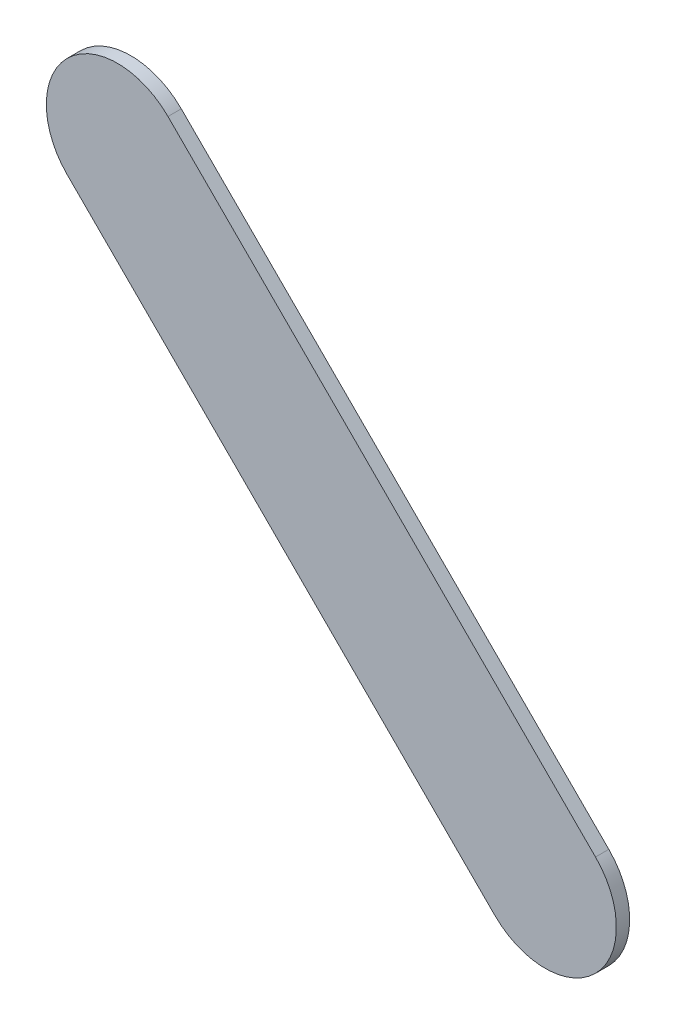
ISO-10303-21;
HEADER;
FILE_DESCRIPTION(('STEP AP214'),'2;1');
FILE_NAME('part.step','',(''),(''),'','','');
FILE_SCHEMA(('AUTOMOTIVE_DESIGN { 1 0 10303 214 1 1 1 1 }'));
ENDSEC;
DATA;
#1=APPLICATION_CONTEXT('core data for automotive mechanical design processes');
#2=APPLICATION_PROTOCOL_DEFINITION('international standard','automotive_design',2000,#1);
#3=PRODUCT_CONTEXT('',#1,'mechanical');
#4=PRODUCT('Part','Part','',(#3));
#5=PRODUCT_RELATED_PRODUCT_CATEGORY('part','',(#4));
#6=PRODUCT_DEFINITION_FORMATION('','',#4);
#7=PRODUCT_DEFINITION_CONTEXT('part definition',#1,'design');
#8=PRODUCT_DEFINITION('design','',#6,#7);
#9=PRODUCT_DEFINITION_SHAPE('','',#8);
#10=(LENGTH_UNIT() NAMED_UNIT(*) SI_UNIT(.MILLI.,.METRE.));
#11=(NAMED_UNIT(*) PLANE_ANGLE_UNIT() SI_UNIT($,.RADIAN.));
#12=(NAMED_UNIT(*) SI_UNIT($,.STERADIAN.) SOLID_ANGLE_UNIT());
#13=UNCERTAINTY_MEASURE_WITH_UNIT(LENGTH_MEASURE(1.E-05),#10,'distance_accuracy_value','');
#14=(GEOMETRIC_REPRESENTATION_CONTEXT(3) GLOBAL_UNCERTAINTY_ASSIGNED_CONTEXT((#13)) GLOBAL_UNIT_ASSIGNED_CONTEXT((#10,
#11,#12)) REPRESENTATION_CONTEXT('',''));
#15=CARTESIAN_POINT('',(0.,0.,0.));
#16=DIRECTION('',(0.,0.,1.));
#17=DIRECTION('',(1.,0.,0.));
#18=AXIS2_PLACEMENT_3D('',#15,#16,#17);
#19=CARTESIAN_POINT('',(23.22929568,12.31129618,0.));
#20=DIRECTION('',(0.707106781186549,0.707106781186547,0.));
#21=DIRECTION('',(0.707106781186547,-0.707106781186549,0.));
#22=AXIS2_PLACEMENT_3D('',#19,#20,#21);
#23=PLANE('',#22);
#24=DIRECTION('',(0.707106781186547,-0.707106781186549,0.));
#25=VECTOR('',#24,1.);
#26=CARTESIAN_POINT('',(23.22929568,12.31129618,0.03556));
#27=LINE('',#26,#25);
#28=CARTESIAN_POINT('',(23.22929568,12.31129618,0.03556));
#29=VERTEX_POINT('',#28);
#30=CARTESIAN_POINT('',(24.37229568,11.16829618,0.03556));
#31=VERTEX_POINT('',#30);
#32=EDGE_CURVE('E11',#29,#31,#27,.T.);
#33=ORIENTED_EDGE('',*,*,#32,.F.);
#34=DIRECTION('',(0.,0.,1.));
#35=VECTOR('',#34,1.);
#36=CARTESIAN_POINT('',(23.22929568,12.31129618,0.));
#37=LINE('',#36,#35);
#38=CARTESIAN_POINT('',(23.22929568,12.31129618,0.));
#39=VERTEX_POINT('',#38);
#40=EDGE_CURVE('E23',#39,#29,#37,.T.);
#41=ORIENTED_EDGE('',*,*,#40,.F.);
#42=DIRECTION('',(0.707106781186547,-0.707106781186549,0.));
#43=VECTOR('',#42,1.);
#44=CARTESIAN_POINT('',(23.22929568,12.31129618,0.));
#45=LINE('',#44,#43);
#46=CARTESIAN_POINT('',(24.37229568,11.16829618,0.));
#47=VERTEX_POINT('',#46);
#48=EDGE_CURVE('E76',#39,#47,#45,.T.);
#49=ORIENTED_EDGE('',*,*,#48,.T.);
#50=DIRECTION('',(0.,0.,1.));
#51=VECTOR('',#50,1.);
#52=CARTESIAN_POINT('',(24.37229568,11.16829618,0.));
#53=LINE('',#52,#51);
#54=EDGE_CURVE('E36',#47,#31,#53,.T.);
#55=ORIENTED_EDGE('',*,*,#54,.T.);
#56=EDGE_LOOP('',(#33,#41,#49,#55));
#57=FACE_BOUND('',#56,.T.);
#58=ADVANCED_FACE('F16',(#57),#23,.F.);
#59=CARTESIAN_POINT('',(24.5069995,11.303,0.));
#60=DIRECTION('',(0.,0.,-1.));
#61=DIRECTION('',(-0.707106781186552,-0.707106781186543,0.));
#62=AXIS2_PLACEMENT_3D('',#59,#60,#61);
#63=CYLINDRICAL_SURFACE('',#62,0.190499969147464);
#64=CARTESIAN_POINT('',(24.5069995,11.303,0.03556));
#65=DIRECTION('',(0.,0.,1.));
#66=DIRECTION('',(-0.707106781186552,-0.707106781186543,0.));
#67=AXIS2_PLACEMENT_3D('',#64,#65,#66);
#68=CIRCLE('',#67,0.190499969147464);
#69=CARTESIAN_POINT('',(24.64170332,11.43770382,0.03556));
#70=VERTEX_POINT('',#69);
#71=EDGE_CURVE('E84',#31,#70,#68,.T.);
#72=ORIENTED_EDGE('',*,*,#71,.F.);
#73=ORIENTED_EDGE('',*,*,#54,.F.);
#74=CARTESIAN_POINT('',(24.5069995,11.303,0.));
#75=DIRECTION('',(0.,0.,1.));
#76=DIRECTION('',(-0.707106781186552,-0.707106781186543,0.));
#77=AXIS2_PLACEMENT_3D('',#74,#75,#76);
#78=CIRCLE('',#77,0.190499969147464);
#79=CARTESIAN_POINT('',(24.64170332,11.43770382,0.));
#80=VERTEX_POINT('',#79);
#81=EDGE_CURVE('E82',#47,#80,#78,.T.);
#82=ORIENTED_EDGE('',*,*,#81,.T.);
#83=DIRECTION('',(0.,0.,1.));
#84=VECTOR('',#83,1.);
#85=CARTESIAN_POINT('',(24.64170332,11.43770382,0.));
#86=LINE('',#85,#84);
#87=EDGE_CURVE('E68',#80,#70,#86,.T.);
#88=ORIENTED_EDGE('',*,*,#87,.T.);
#89=EDGE_LOOP('',(#72,#73,#82,#88));
#90=FACE_BOUND('',#89,.T.);
#91=ADVANCED_FACE('F88',(#90),#63,.T.);
#92=CARTESIAN_POINT('',(24.64170332,11.43770382,0.));
#93=DIRECTION('',(-0.707106781186548,-0.707106781186548,0.));
#94=DIRECTION('',(-0.707106781186548,0.707106781186548,0.));
#95=AXIS2_PLACEMENT_3D('',#92,#93,#94);
#96=PLANE('',#95);
#97=DIRECTION('',(-0.707106781186548,0.707106781186548,0.));
#98=VECTOR('',#97,1.);
#99=CARTESIAN_POINT('',(24.64170332,11.43770382,0.03556));
#100=LINE('',#99,#98);
#101=CARTESIAN_POINT('',(23.49870332,12.58070382,0.03556));
#102=VERTEX_POINT('',#101);
#103=EDGE_CURVE('E72',#70,#102,#100,.T.);
#104=ORIENTED_EDGE('',*,*,#103,.F.);
#105=ORIENTED_EDGE('',*,*,#87,.F.);
#106=DIRECTION('',(-0.707106781186548,0.707106781186548,0.));
#107=VECTOR('',#106,1.);
#108=CARTESIAN_POINT('',(24.64170332,11.43770382,0.));
#109=LINE('',#108,#107);
#110=CARTESIAN_POINT('',(23.49870332,12.58070382,0.));
#111=VERTEX_POINT('',#110);
#112=EDGE_CURVE('E63',#80,#111,#109,.T.);
#113=ORIENTED_EDGE('',*,*,#112,.T.);
#114=DIRECTION('',(0.,0.,1.));
#115=VECTOR('',#114,1.);
#116=CARTESIAN_POINT('',(23.49870332,12.58070382,0.));
#117=LINE('',#116,#115);
#118=EDGE_CURVE('E53',#111,#102,#117,.T.);
#119=ORIENTED_EDGE('',*,*,#118,.T.);
#120=EDGE_LOOP('',(#104,#105,#113,#119));
#121=FACE_BOUND('',#120,.T.);
#122=ADVANCED_FACE('F66',(#121),#96,.F.);
#123=CARTESIAN_POINT('',(23.3639995,12.446,0.));
#124=DIRECTION('',(0.,0.,-1.));
#125=DIRECTION('',(0.707106781186543,0.707106781186552,0.));
#126=AXIS2_PLACEMENT_3D('',#123,#124,#125);
#127=CYLINDRICAL_SURFACE('',#126,0.190499969147463);
#128=CARTESIAN_POINT('',(23.3639995,12.446,0.03556));
#129=DIRECTION('',(0.,0.,1.));
#130=DIRECTION('',(0.707106781186543,0.707106781186552,0.));
#131=AXIS2_PLACEMENT_3D('',#128,#129,#130);
#132=CIRCLE('',#131,0.190499969147463);
#133=EDGE_CURVE('E59',#102,#29,#132,.T.);
#134=ORIENTED_EDGE('',*,*,#133,.F.);
#135=ORIENTED_EDGE('',*,*,#118,.F.);
#136=CARTESIAN_POINT('',(23.3639995,12.446,0.));
#137=DIRECTION('',(0.,0.,1.));
#138=DIRECTION('',(0.707106781186543,0.707106781186552,0.));
#139=AXIS2_PLACEMENT_3D('',#136,#137,#138);
#140=CIRCLE('',#139,0.190499969147463);
#141=EDGE_CURVE('E57',#111,#39,#140,.T.);
#142=ORIENTED_EDGE('',*,*,#141,.T.);
#143=ORIENTED_EDGE('',*,*,#40,.T.);
#144=EDGE_LOOP('',(#134,#135,#142,#143));
#145=FACE_BOUND('',#144,.T.);
#146=ADVANCED_FACE('F55',(#145),#127,.T.);
#147=CARTESIAN_POINT('',(23.9354995,11.8745,0.));
#148=DIRECTION('',(0.,0.,1.));
#149=DIRECTION('',(1.,0.,0.));
#150=AXIS2_PLACEMENT_3D('',#147,#148,#149);
#151=PLANE('',#150);
#152=ORIENTED_EDGE('',*,*,#141,.F.);
#153=ORIENTED_EDGE('',*,*,#112,.F.);
#154=ORIENTED_EDGE('',*,*,#81,.F.);
#155=ORIENTED_EDGE('',*,*,#48,.F.);
#156=EDGE_LOOP('',(#152,#153,#154,#155));
#157=FACE_BOUND('',#156,.T.);
#158=ADVANCED_FACE('F75',(#157),#151,.F.);
#159=CARTESIAN_POINT('',(23.9354995,11.8745,0.03556));
#160=DIRECTION('',(0.,0.,1.));
#161=DIRECTION('',(1.,0.,0.));
#162=AXIS2_PLACEMENT_3D('',#159,#160,#161);
#163=PLANE('',#162);
#164=ORIENTED_EDGE('',*,*,#32,.T.);
#165=ORIENTED_EDGE('',*,*,#71,.T.);
#166=ORIENTED_EDGE('',*,*,#103,.T.);
#167=ORIENTED_EDGE('',*,*,#133,.T.);
#168=EDGE_LOOP('',(#164,#165,#166,#167));
#169=FACE_BOUND('',#168,.T.);
#170=ADVANCED_FACE('F90',(#169),#163,.T.);
#171=CLOSED_SHELL('',(#58,#91,#122,#146,#158,#170));
#172=MANIFOLD_SOLID_BREP('B1',#171);
#173=ADVANCED_BREP_SHAPE_REPRESENTATION('',(#18,#172),#14);
#174=SHAPE_DEFINITION_REPRESENTATION(#9,#173);
ENDSEC;
END-ISO-10303-21;
